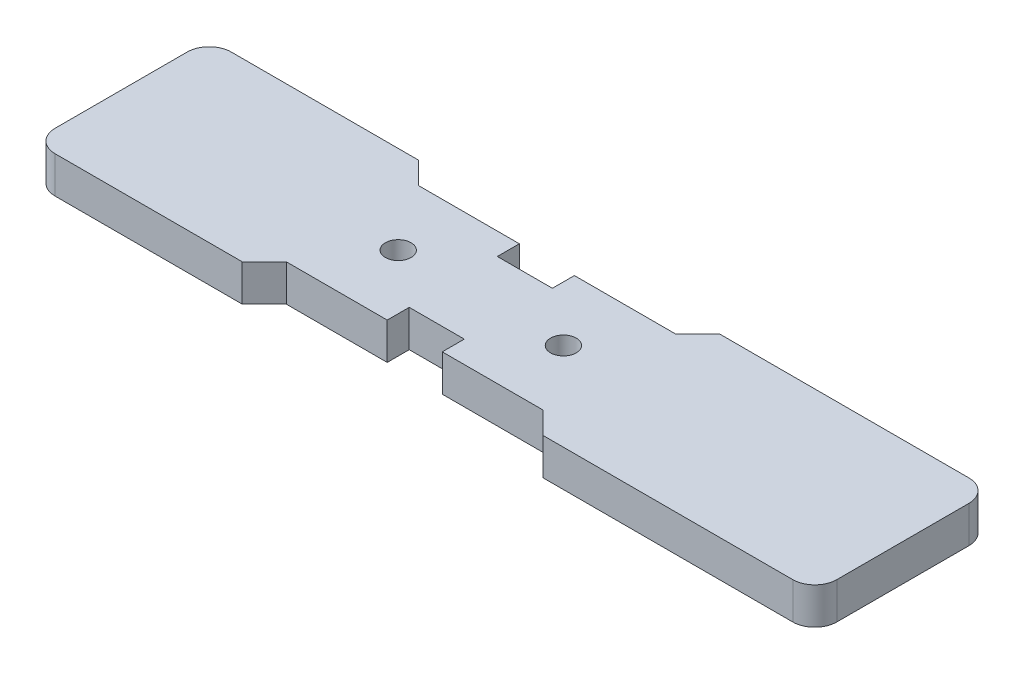
ISO-10303-21;
HEADER;
FILE_DESCRIPTION(('STEP AP214'),'2;1');
FILE_NAME('part.step','',(''),(''),'','','');
FILE_SCHEMA(('AUTOMOTIVE_DESIGN { 1 0 10303 214 1 1 1 1 }'));
ENDSEC;
DATA;
#1=APPLICATION_CONTEXT('core data for automotive mechanical design processes');
#2=APPLICATION_PROTOCOL_DEFINITION('international standard','automotive_design',2000,#1);
#3=PRODUCT_CONTEXT('',#1,'mechanical');
#4=PRODUCT('Part','Part','',(#3));
#5=PRODUCT_RELATED_PRODUCT_CATEGORY('part','',(#4));
#6=PRODUCT_DEFINITION_FORMATION('','',#4);
#7=PRODUCT_DEFINITION_CONTEXT('part definition',#1,'design');
#8=PRODUCT_DEFINITION('design','',#6,#7);
#9=PRODUCT_DEFINITION_SHAPE('','',#8);
#10=(LENGTH_UNIT() NAMED_UNIT(*) SI_UNIT(.MILLI.,.METRE.));
#11=(NAMED_UNIT(*) PLANE_ANGLE_UNIT() SI_UNIT($,.RADIAN.));
#12=(NAMED_UNIT(*) SI_UNIT($,.STERADIAN.) SOLID_ANGLE_UNIT());
#13=UNCERTAINTY_MEASURE_WITH_UNIT(LENGTH_MEASURE(1.E-05),#10,'distance_accuracy_value','');
#14=(GEOMETRIC_REPRESENTATION_CONTEXT(3) GLOBAL_UNCERTAINTY_ASSIGNED_CONTEXT((#13)) GLOBAL_UNIT_ASSIGNED_CONTEXT((#10,
#11,#12)) REPRESENTATION_CONTEXT('',''));
#15=CARTESIAN_POINT('',(0.,0.,0.));
#16=DIRECTION('',(0.,0.,1.));
#17=DIRECTION('',(1.,0.,0.));
#18=AXIS2_PLACEMENT_3D('',#15,#16,#17);
#19=CARTESIAN_POINT('',(-17.5,5.,-9.00000000000001));
#20=DIRECTION('',(0.,0.,1.));
#21=DIRECTION('',(1.,0.,0.));
#22=AXIS2_PLACEMENT_3D('',#19,#20,#21);
#23=PLANE('',#22);
#24=DIRECTION('',(-1.,0.,0.));
#25=VECTOR('',#24,1.);
#26=CARTESIAN_POINT('',(-17.5,5.,-9.00000000000001));
#27=LINE('',#26,#25);
#28=CARTESIAN_POINT('',(-3.75,5.,-9.00000000000001));
#29=VERTEX_POINT('',#28);
#30=CARTESIAN_POINT('',(-17.5,5.,-9.00000000000001));
#31=VERTEX_POINT('',#30);
#32=EDGE_CURVE('E248',#29,#31,#27,.T.);
#33=ORIENTED_EDGE('',*,*,#32,.F.);
#34=DIRECTION('',(0.,-1.,0.));
#35=VECTOR('',#34,1.);
#36=CARTESIAN_POINT('',(-3.75,5.,-9.00000000000001));
#37=LINE('',#36,#35);
#38=CARTESIAN_POINT('',(-3.75,0.,-9.00000000000001));
#39=VERTEX_POINT('',#38);
#40=EDGE_CURVE('E403',#29,#39,#37,.T.);
#41=ORIENTED_EDGE('',*,*,#40,.T.);
#42=DIRECTION('',(-1.,0.,0.));
#43=VECTOR('',#42,1.);
#44=CARTESIAN_POINT('',(-17.5,0.,-9.00000000000001));
#45=LINE('',#44,#43);
#46=CARTESIAN_POINT('',(-17.5,0.,-9.00000000000001));
#47=VERTEX_POINT('',#46);
#48=EDGE_CURVE('E256',#39,#47,#45,.T.);
#49=ORIENTED_EDGE('',*,*,#48,.T.);
#50=DIRECTION('',(0.,-1.,0.));
#51=VECTOR('',#50,1.);
#52=CARTESIAN_POINT('',(-17.5,5.,-9.00000000000001));
#53=LINE('',#52,#51);
#54=EDGE_CURVE('E245',#31,#47,#53,.T.);
#55=ORIENTED_EDGE('',*,*,#54,.F.);
#56=EDGE_LOOP('',(#33,#41,#49,#55));
#57=FACE_BOUND('',#56,.T.);
#58=ADVANCED_FACE('F41',(#57),#23,.F.);
#59=CARTESIAN_POINT('',(-17.5,5.,9.00000000000001));
#60=DIRECTION('',(0.,0.,-1.));
#61=DIRECTION('',(-1.,0.,0.));
#62=AXIS2_PLACEMENT_3D('',#59,#60,#61);
#63=PLANE('',#62);
#64=DIRECTION('',(1.,0.,0.));
#65=VECTOR('',#64,1.);
#66=CARTESIAN_POINT('',(-17.5,5.,9.00000000000001));
#67=LINE('',#66,#65);
#68=CARTESIAN_POINT('',(3.75,5.,9.00000000000002));
#69=VERTEX_POINT('',#68);
#70=CARTESIAN_POINT('',(17.5,5.,9.00000000000001));
#71=VERTEX_POINT('',#70);
#72=EDGE_CURVE('E219',#69,#71,#67,.T.);
#73=ORIENTED_EDGE('',*,*,#72,.F.);
#74=DIRECTION('',(0.,-1.,0.));
#75=VECTOR('',#74,1.);
#76=CARTESIAN_POINT('',(3.75,5.,9.00000000000002));
#77=LINE('',#76,#75);
#78=CARTESIAN_POINT('',(3.75,0.,9.00000000000002));
#79=VERTEX_POINT('',#78);
#80=EDGE_CURVE('E203',#69,#79,#77,.T.);
#81=ORIENTED_EDGE('',*,*,#80,.T.);
#82=DIRECTION('',(1.,0.,0.));
#83=VECTOR('',#82,1.);
#84=CARTESIAN_POINT('',(-17.5,0.,9.00000000000001));
#85=LINE('',#84,#83);
#86=CARTESIAN_POINT('',(17.5,0.,9.00000000000001));
#87=VERTEX_POINT('',#86);
#88=EDGE_CURVE('E235',#79,#87,#85,.T.);
#89=ORIENTED_EDGE('',*,*,#88,.T.);
#90=DIRECTION('',(0.,-1.,0.));
#91=VECTOR('',#90,1.);
#92=CARTESIAN_POINT('',(17.5,5.,9.00000000000001));
#93=LINE('',#92,#91);
#94=EDGE_CURVE('E228',#71,#87,#93,.T.);
#95=ORIENTED_EDGE('',*,*,#94,.F.);
#96=EDGE_LOOP('',(#73,#81,#89,#95));
#97=FACE_BOUND('',#96,.T.);
#98=ADVANCED_FACE('F226',(#97),#63,.F.);
#99=CARTESIAN_POINT('',(57.5,5.,12.));
#100=DIRECTION('',(0.,0.,-1.));
#101=DIRECTION('',(-1.,0.,0.));
#102=AXIS2_PLACEMENT_3D('',#99,#100,#101);
#103=PLANE('',#102);
#104=DIRECTION('',(1.,0.,0.));
#105=VECTOR('',#104,1.);
#106=CARTESIAN_POINT('',(0.,5.,12.));
#107=LINE('',#106,#105);
#108=CARTESIAN_POINT('',(20.5,5.,12.));
#109=VERTEX_POINT('',#108);
#110=CARTESIAN_POINT('',(54.5,5.,12.));
#111=VERTEX_POINT('',#110);
#112=EDGE_CURVE('E263',#109,#111,#107,.T.);
#113=ORIENTED_EDGE('',*,*,#112,.F.);
#114=DIRECTION('',(0.,-1.,0.));
#115=VECTOR('',#114,1.);
#116=CARTESIAN_POINT('',(20.5,5.,12.));
#117=LINE('',#116,#115);
#118=CARTESIAN_POINT('',(20.5,0.,12.));
#119=VERTEX_POINT('',#118);
#120=EDGE_CURVE('E50',#109,#119,#117,.T.);
#121=ORIENTED_EDGE('',*,*,#120,.T.);
#122=DIRECTION('',(1.,0.,0.));
#123=VECTOR('',#122,1.);
#124=CARTESIAN_POINT('',(57.5,0.,12.));
#125=LINE('',#124,#123);
#126=CARTESIAN_POINT('',(54.5,0.,12.));
#127=VERTEX_POINT('',#126);
#128=EDGE_CURVE('E242',#119,#127,#125,.T.);
#129=ORIENTED_EDGE('',*,*,#128,.T.);
#130=DIRECTION('',(0.,-1.,0.));
#131=VECTOR('',#130,1.);
#132=CARTESIAN_POINT('',(54.5,5.,12.));
#133=LINE('',#132,#131);
#134=EDGE_CURVE('E316',#127,#111,#133,.F.);
#135=ORIENTED_EDGE('',*,*,#134,.T.);
#136=EDGE_LOOP('',(#113,#121,#129,#135));
#137=FACE_BOUND('',#136,.T.);
#138=ADVANCED_FACE('F365',(#137),#103,.F.);
#139=CARTESIAN_POINT('',(-49.,5.,-12.));
#140=DIRECTION('',(0.,0.,1.));
#141=DIRECTION('',(1.,0.,0.));
#142=AXIS2_PLACEMENT_3D('',#139,#140,#141);
#143=PLANE('',#142);
#144=DIRECTION('',(-1.,0.,0.));
#145=VECTOR('',#144,1.);
#146=CARTESIAN_POINT('',(-49.,0.,-12.));
#147=LINE('',#146,#145);
#148=CARTESIAN_POINT('',(54.5,0.,-12.));
#149=VERTEX_POINT('',#148);
#150=CARTESIAN_POINT('',(20.5,0.,-12.));
#151=VERTEX_POINT('',#150);
#152=EDGE_CURVE('E279',#149,#151,#147,.T.);
#153=ORIENTED_EDGE('',*,*,#152,.T.);
#154=DIRECTION('',(0.,1.,0.));
#155=VECTOR('',#154,1.);
#156=CARTESIAN_POINT('',(20.5,5.,-12.));
#157=LINE('',#156,#155);
#158=CARTESIAN_POINT('',(20.5,5.,-12.));
#159=VERTEX_POINT('',#158);
#160=EDGE_CURVE('E350',#151,#159,#157,.T.);
#161=ORIENTED_EDGE('',*,*,#160,.T.);
#162=DIRECTION('',(-1.,0.,0.));
#163=VECTOR('',#162,1.);
#164=CARTESIAN_POINT('',(0.,5.,-12.));
#165=LINE('',#164,#163);
#166=CARTESIAN_POINT('',(54.5,5.,-12.));
#167=VERTEX_POINT('',#166);
#168=EDGE_CURVE('E267',#167,#159,#165,.T.);
#169=ORIENTED_EDGE('',*,*,#168,.F.);
#170=DIRECTION('',(0.,-1.,0.));
#171=VECTOR('',#170,1.);
#172=CARTESIAN_POINT('',(54.5,5.,-12.));
#173=LINE('',#172,#171);
#174=EDGE_CURVE('E290',#167,#149,#173,.T.);
#175=ORIENTED_EDGE('',*,*,#174,.T.);
#176=EDGE_LOOP('',(#153,#161,#169,#175));
#177=FACE_BOUND('',#176,.T.);
#178=ADVANCED_FACE('F388',(#177),#143,.F.);
#179=CARTESIAN_POINT('',(-46.,0.,12.));
#180=VERTEX_POINT('',#179);
#181=CARTESIAN_POINT('',(-20.5,0.,12.));
#182=VERTEX_POINT('',#181);
#183=EDGE_CURVE('E273',#180,#182,#125,.T.);
#184=ORIENTED_EDGE('',*,*,#183,.T.);
#185=DIRECTION('',(0.,1.,0.));
#186=VECTOR('',#185,1.);
#187=CARTESIAN_POINT('',(-20.5,5.,12.));
#188=LINE('',#187,#186);
#189=CARTESIAN_POINT('',(-20.5,5.,12.));
#190=VERTEX_POINT('',#189);
#191=EDGE_CURVE('E11',#182,#190,#188,.T.);
#192=ORIENTED_EDGE('',*,*,#191,.T.);
#193=CARTESIAN_POINT('',(-46.,5.,12.));
#194=VERTEX_POINT('',#193);
#195=EDGE_CURVE('E260',#194,#190,#107,.T.);
#196=ORIENTED_EDGE('',*,*,#195,.F.);
#197=DIRECTION('',(0.,-1.,0.));
#198=VECTOR('',#197,1.);
#199=CARTESIAN_POINT('',(-46.,5.,12.));
#200=LINE('',#199,#198);
#201=EDGE_CURVE('E327',#194,#180,#200,.T.);
#202=ORIENTED_EDGE('',*,*,#201,.T.);
#203=EDGE_LOOP('',(#184,#192,#196,#202));
#204=FACE_BOUND('',#203,.T.);
#205=ADVANCED_FACE('F455',(#204),#103,.F.);
#206=CARTESIAN_POINT('',(57.5,5.,-12.));
#207=DIRECTION('',(-1.,0.,0.));
#208=DIRECTION('',(0.,0.,1.));
#209=AXIS2_PLACEMENT_3D('',#206,#207,#208);
#210=PLANE('',#209);
#211=DIRECTION('',(0.,0.,-1.));
#212=VECTOR('',#211,1.);
#213=CARTESIAN_POINT('',(57.5,0.,-12.));
#214=LINE('',#213,#212);
#215=CARTESIAN_POINT('',(57.5,0.,9.));
#216=VERTEX_POINT('',#215);
#217=CARTESIAN_POINT('',(57.5,0.,-8.99999999999999));
#218=VERTEX_POINT('',#217);
#219=EDGE_CURVE('E275',#216,#218,#214,.T.);
#220=ORIENTED_EDGE('',*,*,#219,.T.);
#221=DIRECTION('',(0.,-1.,0.));
#222=VECTOR('',#221,1.);
#223=CARTESIAN_POINT('',(57.5,5.,-8.99999999999999));
#224=LINE('',#223,#222);
#225=CARTESIAN_POINT('',(57.5,5.,-8.99999999999999));
#226=VERTEX_POINT('',#225);
#227=EDGE_CURVE('E306',#218,#226,#224,.F.);
#228=ORIENTED_EDGE('',*,*,#227,.T.);
#229=DIRECTION('',(0.,0.,-1.));
#230=VECTOR('',#229,1.);
#231=CARTESIAN_POINT('',(57.5,5.,-12.));
#232=LINE('',#231,#230);
#233=CARTESIAN_POINT('',(57.5,5.,9.));
#234=VERTEX_POINT('',#233);
#235=EDGE_CURVE('E262',#234,#226,#232,.T.);
#236=ORIENTED_EDGE('',*,*,#235,.F.);
#237=DIRECTION('',(0.,-1.,0.));
#238=VECTOR('',#237,1.);
#239=CARTESIAN_POINT('',(57.5,5.,9.));
#240=LINE('',#239,#238);
#241=EDGE_CURVE('E303',#234,#216,#240,.T.);
#242=ORIENTED_EDGE('',*,*,#241,.T.);
#243=EDGE_LOOP('',(#220,#228,#236,#242));
#244=FACE_BOUND('',#243,.T.);
#245=ADVANCED_FACE('F380',(#244),#210,.F.);
#246=CARTESIAN_POINT('',(-20.5,5.,-12.));
#247=VERTEX_POINT('',#246);
#248=CARTESIAN_POINT('',(-46.,5.,-12.));
#249=VERTEX_POINT('',#248);
#250=EDGE_CURVE('E266',#247,#249,#165,.T.);
#251=ORIENTED_EDGE('',*,*,#250,.F.);
#252=DIRECTION('',(0.,-1.,0.));
#253=VECTOR('',#252,1.);
#254=CARTESIAN_POINT('',(-20.5,5.,-12.));
#255=LINE('',#254,#253);
#256=CARTESIAN_POINT('',(-20.5,0.,-12.));
#257=VERTEX_POINT('',#256);
#258=EDGE_CURVE('E359',#247,#257,#255,.T.);
#259=ORIENTED_EDGE('',*,*,#258,.T.);
#260=CARTESIAN_POINT('',(-46.,0.,-12.));
#261=VERTEX_POINT('',#260);
#262=EDGE_CURVE('E278',#257,#261,#147,.T.);
#263=ORIENTED_EDGE('',*,*,#262,.T.);
#264=DIRECTION('',(0.,-1.,0.));
#265=VECTOR('',#264,1.);
#266=CARTESIAN_POINT('',(-46.,5.,-12.));
#267=LINE('',#266,#265);
#268=EDGE_CURVE('E324',#261,#249,#267,.F.);
#269=ORIENTED_EDGE('',*,*,#268,.T.);
#270=EDGE_LOOP('',(#251,#259,#263,#269));
#271=FACE_BOUND('',#270,.T.);
#272=ADVANCED_FACE('F438',(#271),#143,.F.);
#273=CARTESIAN_POINT('',(-49.,5.,12.));
#274=DIRECTION('',(1.,0.,0.));
#275=DIRECTION('',(0.,0.,-1.));
#276=AXIS2_PLACEMENT_3D('',#273,#274,#275);
#277=PLANE('',#276);
#278=DIRECTION('',(0.,0.,1.));
#279=VECTOR('',#278,1.);
#280=CARTESIAN_POINT('',(-49.,5.,12.));
#281=LINE('',#280,#279);
#282=CARTESIAN_POINT('',(-49.,5.,-9.));
#283=VERTEX_POINT('',#282);
#284=CARTESIAN_POINT('',(-49.,5.,8.99999999999999));
#285=VERTEX_POINT('',#284);
#286=EDGE_CURVE('E269',#283,#285,#281,.T.);
#287=ORIENTED_EDGE('',*,*,#286,.F.);
#288=DIRECTION('',(0.,-1.,0.));
#289=VECTOR('',#288,1.);
#290=CARTESIAN_POINT('',(-49.,5.,-9.));
#291=LINE('',#290,#289);
#292=CARTESIAN_POINT('',(-49.,0.,-9.));
#293=VERTEX_POINT('',#292);
#294=EDGE_CURVE('E321',#283,#293,#291,.T.);
#295=ORIENTED_EDGE('',*,*,#294,.T.);
#296=DIRECTION('',(0.,0.,1.));
#297=VECTOR('',#296,1.);
#298=CARTESIAN_POINT('',(-49.,0.,12.));
#299=LINE('',#298,#297);
#300=CARTESIAN_POINT('',(-49.,0.,8.99999999999999));
#301=VERTEX_POINT('',#300);
#302=EDGE_CURVE('E282',#293,#301,#299,.T.);
#303=ORIENTED_EDGE('',*,*,#302,.T.);
#304=DIRECTION('',(0.,-1.,0.));
#305=VECTOR('',#304,1.);
#306=CARTESIAN_POINT('',(-49.,5.,8.99999999999999));
#307=LINE('',#306,#305);
#308=EDGE_CURVE('E319',#301,#285,#307,.F.);
#309=ORIENTED_EDGE('',*,*,#308,.T.);
#310=EDGE_LOOP('',(#287,#295,#303,#309));
#311=FACE_BOUND('',#310,.T.);
#312=ADVANCED_FACE('F448',(#311),#277,.F.);
#313=CARTESIAN_POINT('',(0.,5.,0.));
#314=DIRECTION('',(0.,-1.,0.));
#315=DIRECTION('',(0.,0.,-1.));
#316=AXIS2_PLACEMENT_3D('',#313,#314,#315);
#317=PLANE('',#316);
#318=CARTESIAN_POINT('',(-11.25,5.,0.));
#319=DIRECTION('',(0.,-1.,0.));
#320=DIRECTION('',(0.,0.,-1.));
#321=AXIS2_PLACEMENT_3D('',#318,#319,#320);
#322=CIRCLE('',#321,1.75);
#323=CARTESIAN_POINT('',(-11.25,5.,-1.75));
#324=VERTEX_POINT('',#323);
#325=EDGE_CURVE('E413',#324,#324,#322,.T.);
#326=ORIENTED_EDGE('',*,*,#325,.T.);
#327=EDGE_LOOP('',(#326));
#328=FACE_BOUND('',#327,.T.);
#329=CARTESIAN_POINT('',(11.25,5.,0.));
#330=DIRECTION('',(0.,-1.,0.));
#331=DIRECTION('',(0.,0.,1.));
#332=AXIS2_PLACEMENT_3D('',#329,#330,#331);
#333=CIRCLE('',#332,1.75);
#334=CARTESIAN_POINT('',(11.25,5.,1.75));
#335=VERTEX_POINT('',#334);
#336=EDGE_CURVE('E798',#335,#335,#333,.T.);
#337=ORIENTED_EDGE('',*,*,#336,.T.);
#338=EDGE_LOOP('',(#337));
#339=FACE_BOUND('',#338,.T.);
#340=ORIENTED_EDGE('',*,*,#168,.T.);
#341=DIRECTION('',(0.70710678118655,0.,-0.707106781186545));
#342=VECTOR('',#341,1.);
#343=CARTESIAN_POINT('',(17.5,5.,-9.00000000000003));
#344=LINE('',#343,#342);
#345=CARTESIAN_POINT('',(17.5,5.,-9.00000000000001));
#346=VERTEX_POINT('',#345);
#347=EDGE_CURVE('E357',#159,#346,#344,.F.);
#348=ORIENTED_EDGE('',*,*,#347,.T.);
#349=CARTESIAN_POINT('',(3.75,5.,-9.00000000000001));
#350=VERTEX_POINT('',#349);
#351=EDGE_CURVE('E257',#346,#350,#27,.T.);
#352=ORIENTED_EDGE('',*,*,#351,.T.);
#353=DIRECTION('',(0.,0.,1.));
#354=VECTOR('',#353,1.);
#355=CARTESIAN_POINT('',(3.75,5.,-6.00000000000002));
#356=LINE('',#355,#354);
#357=CARTESIAN_POINT('',(3.75,5.,-6.00000000000002));
#358=VERTEX_POINT('',#357);
#359=EDGE_CURVE('E422',#350,#358,#356,.T.);
#360=ORIENTED_EDGE('',*,*,#359,.T.);
#361=DIRECTION('',(-1.,0.,0.));
#362=VECTOR('',#361,1.);
#363=CARTESIAN_POINT('',(-3.75,5.,-6.00000000000002));
#364=LINE('',#363,#362);
#365=CARTESIAN_POINT('',(-3.75,5.,-6.00000000000002));
#366=VERTEX_POINT('',#365);
#367=EDGE_CURVE('E407',#358,#366,#364,.T.);
#368=ORIENTED_EDGE('',*,*,#367,.T.);
#369=DIRECTION('',(0.,0.,-1.));
#370=VECTOR('',#369,1.);
#371=CARTESIAN_POINT('',(-3.75,5.,-9.00000000000001));
#372=LINE('',#371,#370);
#373=EDGE_CURVE('E238',#366,#29,#372,.T.);
#374=ORIENTED_EDGE('',*,*,#373,.T.);
#375=ORIENTED_EDGE('',*,*,#32,.T.);
#376=DIRECTION('',(0.707106781186546,0.,0.707106781186549));
#377=VECTOR('',#376,1.);
#378=CARTESIAN_POINT('',(-20.5,5.,-12.));
#379=LINE('',#378,#377);
#380=EDGE_CURVE('E355',#31,#247,#379,.F.);
#381=ORIENTED_EDGE('',*,*,#380,.T.);
#382=ORIENTED_EDGE('',*,*,#250,.T.);
#383=CARTESIAN_POINT('',(-46.,5.,-9.));
#384=DIRECTION('',(0.,-1.,0.));
#385=DIRECTION('',(0.,0.,-1.));
#386=AXIS2_PLACEMENT_3D('',#383,#384,#385);
#387=CIRCLE('',#386,3.);
#388=EDGE_CURVE('E310',#249,#283,#387,.F.);
#389=ORIENTED_EDGE('',*,*,#388,.T.);
#390=ORIENTED_EDGE('',*,*,#286,.T.);
#391=CARTESIAN_POINT('',(-46.,5.,8.99999999999999));
#392=DIRECTION('',(0.,-1.,0.));
#393=DIRECTION('',(0.,0.,-1.));
#394=AXIS2_PLACEMENT_3D('',#391,#392,#393);
#395=CIRCLE('',#394,3.);
#396=EDGE_CURVE('E308',#285,#194,#395,.F.);
#397=ORIENTED_EDGE('',*,*,#396,.T.);
#398=ORIENTED_EDGE('',*,*,#195,.T.);
#399=DIRECTION('',(-0.707106781186549,0.,0.707106781186547));
#400=VECTOR('',#399,1.);
#401=CARTESIAN_POINT('',(-17.5,5.,9.00000000000002));
#402=LINE('',#401,#400);
#403=CARTESIAN_POINT('',(-17.5,5.,9.00000000000001));
#404=VERTEX_POINT('',#403);
#405=EDGE_CURVE('E352',#190,#404,#402,.F.);
#406=ORIENTED_EDGE('',*,*,#405,.T.);
#407=CARTESIAN_POINT('',(-3.75,5.,9.00000000000001));
#408=VERTEX_POINT('',#407);
#409=EDGE_CURVE('E229',#404,#408,#67,.T.);
#410=ORIENTED_EDGE('',*,*,#409,.T.);
#411=DIRECTION('',(0.,0.,-1.));
#412=VECTOR('',#411,1.);
#413=CARTESIAN_POINT('',(-3.75,5.,9.00000000000001));
#414=LINE('',#413,#412);
#415=CARTESIAN_POINT('',(-3.75,5.,6.00000000000002));
#416=VERTEX_POINT('',#415);
#417=EDGE_CURVE('E223',#408,#416,#414,.T.);
#418=ORIENTED_EDGE('',*,*,#417,.T.);
#419=DIRECTION('',(1.,0.,0.));
#420=VECTOR('',#419,1.);
#421=CARTESIAN_POINT('',(-3.75,5.,6.00000000000002));
#422=LINE('',#421,#420);
#423=CARTESIAN_POINT('',(3.75,5.,6.00000000000002));
#424=VERTEX_POINT('',#423);
#425=EDGE_CURVE('E215',#416,#424,#422,.T.);
#426=ORIENTED_EDGE('',*,*,#425,.T.);
#427=DIRECTION('',(0.,0.,1.));
#428=VECTOR('',#427,1.);
#429=CARTESIAN_POINT('',(3.75,5.,6.00000000000002));
#430=LINE('',#429,#428);
#431=EDGE_CURVE('E206',#424,#69,#430,.T.);
#432=ORIENTED_EDGE('',*,*,#431,.T.);
#433=ORIENTED_EDGE('',*,*,#72,.T.);
#434=DIRECTION('',(-0.707106781186546,0.,-0.707106781186549));
#435=VECTOR('',#434,1.);
#436=CARTESIAN_POINT('',(20.5,5.,12.));
#437=LINE('',#436,#435);
#438=EDGE_CURVE('E57',#71,#109,#437,.F.);
#439=ORIENTED_EDGE('',*,*,#438,.T.);
#440=ORIENTED_EDGE('',*,*,#112,.T.);
#441=CARTESIAN_POINT('',(54.5,5.,9.));
#442=DIRECTION('',(0.,-1.,0.));
#443=DIRECTION('',(0.,0.,-1.));
#444=AXIS2_PLACEMENT_3D('',#441,#442,#443);
#445=CIRCLE('',#444,3.);
#446=EDGE_CURVE('E312',#111,#234,#445,.F.);
#447=ORIENTED_EDGE('',*,*,#446,.T.);
#448=ORIENTED_EDGE('',*,*,#235,.T.);
#449=CARTESIAN_POINT('',(54.5,5.,-8.99999999999999));
#450=DIRECTION('',(0.,-1.,0.));
#451=DIRECTION('',(0.,0.,-1.));
#452=AXIS2_PLACEMENT_3D('',#449,#450,#451);
#453=CIRCLE('',#452,3.);
#454=EDGE_CURVE('E314',#226,#167,#453,.F.);
#455=ORIENTED_EDGE('',*,*,#454,.T.);
#456=EDGE_LOOP('',(#340,#348,#352,#360,#368,#374,#375,#381,#382,#389,#390,#397,#398,#406,#410,
#418,#426,#432,#433,#439,#440,#447,#448,#455));
#457=FACE_BOUND('',#456,.T.);
#458=ADVANCED_FACE('F218',(#328,#339,#457),#317,.F.);
#459=CARTESIAN_POINT('',(0.,0.,0.));
#460=DIRECTION('',(0.,-1.,0.));
#461=DIRECTION('',(0.,0.,-1.));
#462=AXIS2_PLACEMENT_3D('',#459,#460,#461);
#463=PLANE('',#462);
#464=CARTESIAN_POINT('',(-11.25,0.,0.));
#465=DIRECTION('',(0.,-1.,0.));
#466=DIRECTION('',(0.,0.,-1.));
#467=AXIS2_PLACEMENT_3D('',#464,#465,#466);
#468=CIRCLE('',#467,1.75);
#469=CARTESIAN_POINT('',(-11.25,0.,-1.75));
#470=VERTEX_POINT('',#469);
#471=EDGE_CURVE('E803',#470,#470,#468,.T.);
#472=ORIENTED_EDGE('',*,*,#471,.F.);
#473=EDGE_LOOP('',(#472));
#474=FACE_BOUND('',#473,.T.);
#475=CARTESIAN_POINT('',(11.25,0.,0.));
#476=DIRECTION('',(0.,-1.,0.));
#477=DIRECTION('',(0.,0.,1.));
#478=AXIS2_PLACEMENT_3D('',#475,#476,#477);
#479=CIRCLE('',#478,1.75);
#480=CARTESIAN_POINT('',(11.25,0.,1.75));
#481=VERTEX_POINT('',#480);
#482=EDGE_CURVE('E801',#481,#481,#479,.T.);
#483=ORIENTED_EDGE('',*,*,#482,.F.);
#484=EDGE_LOOP('',(#483));
#485=FACE_BOUND('',#484,.T.);
#486=CARTESIAN_POINT('',(17.5,0.,-9.00000000000001));
#487=VERTEX_POINT('',#486);
#488=CARTESIAN_POINT('',(3.75,0.,-9.00000000000002));
#489=VERTEX_POINT('',#488);
#490=EDGE_CURVE('E253',#487,#489,#45,.T.);
#491=ORIENTED_EDGE('',*,*,#490,.F.);
#492=DIRECTION('',(-0.70710678118655,0.,0.707106781186545));
#493=VECTOR('',#492,1.);
#494=CARTESIAN_POINT('',(4.24999999999992,0.,4.24999999999995));
#495=LINE('',#494,#493);
#496=EDGE_CURVE('E348',#487,#151,#495,.F.);
#497=ORIENTED_EDGE('',*,*,#496,.T.);
#498=ORIENTED_EDGE('',*,*,#152,.F.);
#499=CARTESIAN_POINT('',(54.5,0.,-8.99999999999999));
#500=DIRECTION('',(0.,-1.,0.));
#501=DIRECTION('',(0.,0.,-1.));
#502=AXIS2_PLACEMENT_3D('',#499,#500,#501);
#503=CIRCLE('',#502,3.);
#504=EDGE_CURVE('E301',#149,#218,#503,.T.);
#505=ORIENTED_EDGE('',*,*,#504,.T.);
#506=ORIENTED_EDGE('',*,*,#219,.F.);
#507=CARTESIAN_POINT('',(54.5,0.,9.));
#508=DIRECTION('',(0.,-1.,0.));
#509=DIRECTION('',(0.,0.,-1.));
#510=AXIS2_PLACEMENT_3D('',#507,#508,#509);
#511=CIRCLE('',#510,3.);
#512=EDGE_CURVE('E298',#216,#127,#511,.T.);
#513=ORIENTED_EDGE('',*,*,#512,.T.);
#514=ORIENTED_EDGE('',*,*,#128,.F.);
#515=DIRECTION('',(0.707106781186546,0.,0.707106781186549));
#516=VECTOR('',#515,1.);
#517=CARTESIAN_POINT('',(4.25000000000004,0.,-4.25000000000002));
#518=LINE('',#517,#516);
#519=EDGE_CURVE('E344',#119,#87,#518,.F.);
#520=ORIENTED_EDGE('',*,*,#519,.T.);
#521=ORIENTED_EDGE('',*,*,#88,.F.);
#522=DIRECTION('',(0.,0.,1.));
#523=VECTOR('',#522,1.);
#524=CARTESIAN_POINT('',(3.75,0.,6.00000000000002));
#525=LINE('',#524,#523);
#526=CARTESIAN_POINT('',(3.75,0.,6.00000000000002));
#527=VERTEX_POINT('',#526);
#528=EDGE_CURVE('E209',#527,#79,#525,.T.);
#529=ORIENTED_EDGE('',*,*,#528,.F.);
#530=DIRECTION('',(1.,0.,0.));
#531=VECTOR('',#530,1.);
#532=CARTESIAN_POINT('',(-3.75,0.,6.00000000000002));
#533=LINE('',#532,#531);
#534=CARTESIAN_POINT('',(-3.75,0.,6.00000000000002));
#535=VERTEX_POINT('',#534);
#536=EDGE_CURVE('E224',#535,#527,#533,.T.);
#537=ORIENTED_EDGE('',*,*,#536,.F.);
#538=DIRECTION('',(0.,0.,-1.));
#539=VECTOR('',#538,1.);
#540=CARTESIAN_POINT('',(-3.75,0.,9.00000000000001));
#541=LINE('',#540,#539);
#542=CARTESIAN_POINT('',(-3.75,0.,9.00000000000001));
#543=VERTEX_POINT('',#542);
#544=EDGE_CURVE('E471',#543,#535,#541,.T.);
#545=ORIENTED_EDGE('',*,*,#544,.F.);
#546=CARTESIAN_POINT('',(-17.5,0.,9.00000000000001));
#547=VERTEX_POINT('',#546);
#548=EDGE_CURVE('E230',#547,#543,#85,.T.);
#549=ORIENTED_EDGE('',*,*,#548,.F.);
#550=DIRECTION('',(0.707106781186549,0.,-0.707106781186547));
#551=VECTOR('',#550,1.);
#552=CARTESIAN_POINT('',(-4.24999999999996,0.,-4.24999999999998));
#553=LINE('',#552,#551);
#554=EDGE_CURVE('E342',#547,#182,#553,.F.);
#555=ORIENTED_EDGE('',*,*,#554,.T.);
#556=ORIENTED_EDGE('',*,*,#183,.F.);
#557=CARTESIAN_POINT('',(-46.,0.,8.99999999999999));
#558=DIRECTION('',(0.,-1.,0.));
#559=DIRECTION('',(0.,0.,-1.));
#560=AXIS2_PLACEMENT_3D('',#557,#558,#559);
#561=CIRCLE('',#560,3.);
#562=EDGE_CURVE('E293',#180,#301,#561,.T.);
#563=ORIENTED_EDGE('',*,*,#562,.T.);
#564=ORIENTED_EDGE('',*,*,#302,.F.);
#565=CARTESIAN_POINT('',(-46.,0.,-9.));
#566=DIRECTION('',(0.,-1.,0.));
#567=DIRECTION('',(0.,0.,-1.));
#568=AXIS2_PLACEMENT_3D('',#565,#566,#567);
#569=CIRCLE('',#568,3.);
#570=EDGE_CURVE('E295',#293,#261,#569,.T.);
#571=ORIENTED_EDGE('',*,*,#570,.T.);
#572=ORIENTED_EDGE('',*,*,#262,.F.);
#573=DIRECTION('',(-0.707106781186546,0.,-0.707106781186549));
#574=VECTOR('',#573,1.);
#575=CARTESIAN_POINT('',(-4.25000000000003,0.,4.25000000000001));
#576=LINE('',#575,#574);
#577=EDGE_CURVE('E346',#257,#47,#576,.F.);
#578=ORIENTED_EDGE('',*,*,#577,.T.);
#579=ORIENTED_EDGE('',*,*,#48,.F.);
#580=DIRECTION('',(0.,0.,-1.));
#581=VECTOR('',#580,1.);
#582=CARTESIAN_POINT('',(-3.75,0.,-9.00000000000001));
#583=LINE('',#582,#581);
#584=CARTESIAN_POINT('',(-3.75,0.,-6.00000000000002));
#585=VERTEX_POINT('',#584);
#586=EDGE_CURVE('E419',#585,#39,#583,.T.);
#587=ORIENTED_EDGE('',*,*,#586,.F.);
#588=DIRECTION('',(-1.,0.,0.));
#589=VECTOR('',#588,1.);
#590=CARTESIAN_POINT('',(-3.75,0.,-6.00000000000002));
#591=LINE('',#590,#589);
#592=CARTESIAN_POINT('',(3.75,0.,-6.00000000000002));
#593=VERTEX_POINT('',#592);
#594=EDGE_CURVE('E414',#593,#585,#591,.T.);
#595=ORIENTED_EDGE('',*,*,#594,.F.);
#596=DIRECTION('',(0.,0.,1.));
#597=VECTOR('',#596,1.);
#598=CARTESIAN_POINT('',(3.75,0.,-6.00000000000002));
#599=LINE('',#598,#597);
#600=EDGE_CURVE('E417',#489,#593,#599,.T.);
#601=ORIENTED_EDGE('',*,*,#600,.F.);
#602=EDGE_LOOP('',(#491,#497,#498,#505,#506,#513,#514,#520,#521,#529,#537,#545,#549,#555,#556,
#563,#564,#571,#572,#578,#579,#587,#595,#601));
#603=FACE_BOUND('',#602,.T.);
#604=CARTESIAN_POINT('',(-37.,0.,0.));
#605=DIRECTION('',(0.,-1.,0.));
#606=DIRECTION('',(0.,0.,-1.));
#607=AXIS2_PLACEMENT_3D('',#604,#605,#606);
#608=CIRCLE('',#607,5.);
#609=CARTESIAN_POINT('',(-37.,0.,-5.));
#610=VERTEX_POINT('',#609);
#611=EDGE_CURVE('E287',#610,#610,#608,.T.);
#612=ORIENTED_EDGE('',*,*,#611,.F.);
#613=EDGE_LOOP('',(#612));
#614=FACE_BOUND('',#613,.T.);
#615=CARTESIAN_POINT('',(45.5,0.,0.));
#616=DIRECTION('',(0.,-1.,0.));
#617=DIRECTION('',(0.,0.,-1.));
#618=AXIS2_PLACEMENT_3D('',#615,#616,#617);
#619=CIRCLE('',#618,5.);
#620=CARTESIAN_POINT('',(45.5,0.,-5.));
#621=VERTEX_POINT('',#620);
#622=EDGE_CURVE('E272',#621,#621,#619,.T.);
#623=ORIENTED_EDGE('',*,*,#622,.F.);
#624=EDGE_LOOP('',(#623));
#625=FACE_BOUND('',#624,.T.);
#626=ADVANCED_FACE('F369',(#474,#485,#603,#614,#625),#463,.T.);
#627=CARTESIAN_POINT('',(45.5,-4.,0.));
#628=DIRECTION('',(0.,1.,0.));
#629=DIRECTION('',(0.,0.,1.));
#630=AXIS2_PLACEMENT_3D('',#627,#628,#629);
#631=CYLINDRICAL_SURFACE('',#630,5.);
#632=CARTESIAN_POINT('',(45.5,-3.75,0.));
#633=DIRECTION('',(0.,-1.,0.));
#634=DIRECTION('',(0.,0.,-1.));
#635=AXIS2_PLACEMENT_3D('',#632,#633,#634);
#636=CIRCLE('',#635,5.);
#637=CARTESIAN_POINT('',(45.5,-3.75,-5.));
#638=VERTEX_POINT('',#637);
#639=EDGE_CURVE('E330',#638,#638,#636,.F.);
#640=ORIENTED_EDGE('',*,*,#639,.T.);
#641=EDGE_LOOP('',(#640));
#642=FACE_BOUND('',#641,.T.);
#643=ORIENTED_EDGE('',*,*,#622,.T.);
#644=EDGE_LOOP('',(#643));
#645=FACE_BOUND('',#644,.T.);
#646=ADVANCED_FACE('F518',(#642,#645),#631,.T.);
#647=CARTESIAN_POINT('',(45.5,-4.,0.));
#648=DIRECTION('',(0.,-1.,0.));
#649=DIRECTION('',(0.,0.,-1.));
#650=AXIS2_PLACEMENT_3D('',#647,#648,#649);
#651=PLANE('',#650);
#652=CARTESIAN_POINT('',(45.5,-4.,0.));
#653=DIRECTION('',(0.,-1.,0.));
#654=DIRECTION('',(0.,0.,-1.));
#655=AXIS2_PLACEMENT_3D('',#652,#653,#654);
#656=CIRCLE('',#655,4.75);
#657=CARTESIAN_POINT('',(45.5,-4.,-4.75));
#658=VERTEX_POINT('',#657);
#659=EDGE_CURVE('E333',#658,#658,#656,.T.);
#660=ORIENTED_EDGE('',*,*,#659,.T.);
#661=EDGE_LOOP('',(#660));
#662=FACE_BOUND('',#661,.T.);
#663=ADVANCED_FACE('F514',(#662),#651,.T.);
#664=CARTESIAN_POINT('',(-37.,-4.,0.));
#665=DIRECTION('',(0.,1.,0.));
#666=DIRECTION('',(0.,0.,1.));
#667=AXIS2_PLACEMENT_3D('',#664,#665,#666);
#668=CYLINDRICAL_SURFACE('',#667,5.);
#669=CARTESIAN_POINT('',(-37.,-3.75,0.));
#670=DIRECTION('',(0.,1.,0.));
#671=DIRECTION('',(0.,0.,1.));
#672=AXIS2_PLACEMENT_3D('',#669,#670,#671);
#673=CIRCLE('',#672,5.);
#674=CARTESIAN_POINT('',(-37.,-3.75,5.));
#675=VERTEX_POINT('',#674);
#676=EDGE_CURVE('E336',#675,#675,#673,.T.);
#677=ORIENTED_EDGE('',*,*,#676,.T.);
#678=EDGE_LOOP('',(#677));
#679=FACE_BOUND('',#678,.T.);
#680=ORIENTED_EDGE('',*,*,#611,.T.);
#681=EDGE_LOOP('',(#680));
#682=FACE_BOUND('',#681,.T.);
#683=ADVANCED_FACE('F508',(#679,#682),#668,.T.);
#684=CARTESIAN_POINT('',(-37.,-4.,0.));
#685=DIRECTION('',(0.,1.,0.));
#686=DIRECTION('',(0.,0.,1.));
#687=AXIS2_PLACEMENT_3D('',#684,#685,#686);
#688=PLANE('',#687);
#689=CARTESIAN_POINT('',(-37.,-4.,0.));
#690=DIRECTION('',(0.,1.,0.));
#691=DIRECTION('',(0.,0.,1.));
#692=AXIS2_PLACEMENT_3D('',#689,#690,#691);
#693=CIRCLE('',#692,4.75);
#694=CARTESIAN_POINT('',(-37.,-4.,4.75));
#695=VERTEX_POINT('',#694);
#696=EDGE_CURVE('E339',#695,#695,#693,.F.);
#697=ORIENTED_EDGE('',*,*,#696,.T.);
#698=EDGE_LOOP('',(#697));
#699=FACE_BOUND('',#698,.T.);
#700=ADVANCED_FACE('F502',(#699),#688,.F.);
#701=ORIENTED_EDGE('',*,*,#490,.T.);
#702=DIRECTION('',(0.,-1.,0.));
#703=VECTOR('',#702,1.);
#704=CARTESIAN_POINT('',(3.75,5.,-9.00000000000002));
#705=LINE('',#704,#703);
#706=EDGE_CURVE('E399',#350,#489,#705,.T.);
#707=ORIENTED_EDGE('',*,*,#706,.F.);
#708=ORIENTED_EDGE('',*,*,#351,.F.);
#709=DIRECTION('',(0.,-1.,0.));
#710=VECTOR('',#709,1.);
#711=CARTESIAN_POINT('',(17.5,5.,-9.00000000000001));
#712=LINE('',#711,#710);
#713=EDGE_CURVE('E249',#346,#487,#712,.T.);
#714=ORIENTED_EDGE('',*,*,#713,.T.);
#715=EDGE_LOOP('',(#701,#707,#708,#714));
#716=FACE_BOUND('',#715,.T.);
#717=ADVANCED_FACE('F398',(#716),#23,.F.);
#718=ORIENTED_EDGE('',*,*,#548,.T.);
#719=DIRECTION('',(0.,-1.,0.));
#720=VECTOR('',#719,1.);
#721=CARTESIAN_POINT('',(-3.75,5.,9.00000000000001));
#722=LINE('',#721,#720);
#723=EDGE_CURVE('E214',#408,#543,#722,.T.);
#724=ORIENTED_EDGE('',*,*,#723,.F.);
#725=ORIENTED_EDGE('',*,*,#409,.F.);
#726=DIRECTION('',(0.,-1.,0.));
#727=VECTOR('',#726,1.);
#728=CARTESIAN_POINT('',(-17.5,5.,9.00000000000001));
#729=LINE('',#728,#727);
#730=EDGE_CURVE('E233',#404,#547,#729,.T.);
#731=ORIENTED_EDGE('',*,*,#730,.T.);
#732=EDGE_LOOP('',(#718,#724,#725,#731));
#733=FACE_BOUND('',#732,.T.);
#734=ADVANCED_FACE('F463',(#733),#63,.F.);
#735=CARTESIAN_POINT('',(3.75,5.,6.00000000000002));
#736=DIRECTION('',(1.,0.,0.));
#737=DIRECTION('',(0.,0.,-1.));
#738=AXIS2_PLACEMENT_3D('',#735,#736,#737);
#739=PLANE('',#738);
#740=ORIENTED_EDGE('',*,*,#528,.T.);
#741=ORIENTED_EDGE('',*,*,#80,.F.);
#742=ORIENTED_EDGE('',*,*,#431,.F.);
#743=DIRECTION('',(0.,-1.,0.));
#744=VECTOR('',#743,1.);
#745=CARTESIAN_POINT('',(3.75,5.,6.00000000000002));
#746=LINE('',#745,#744);
#747=EDGE_CURVE('E252',#424,#527,#746,.T.);
#748=ORIENTED_EDGE('',*,*,#747,.T.);
#749=EDGE_LOOP('',(#740,#741,#742,#748));
#750=FACE_BOUND('',#749,.T.);
#751=ADVANCED_FACE('F205',(#750),#739,.F.);
#752=CARTESIAN_POINT('',(-3.75,5.,6.00000000000002));
#753=DIRECTION('',(0.,0.,-1.));
#754=DIRECTION('',(-1.,0.,0.));
#755=AXIS2_PLACEMENT_3D('',#752,#753,#754);
#756=PLANE('',#755);
#757=ORIENTED_EDGE('',*,*,#536,.T.);
#758=ORIENTED_EDGE('',*,*,#747,.F.);
#759=ORIENTED_EDGE('',*,*,#425,.F.);
#760=DIRECTION('',(0.,-1.,0.));
#761=VECTOR('',#760,1.);
#762=CARTESIAN_POINT('',(-3.75,5.,6.00000000000002));
#763=LINE('',#762,#761);
#764=EDGE_CURVE('E477',#416,#535,#763,.T.);
#765=ORIENTED_EDGE('',*,*,#764,.T.);
#766=EDGE_LOOP('',(#757,#758,#759,#765));
#767=FACE_BOUND('',#766,.T.);
#768=ADVANCED_FACE('F482',(#767),#756,.F.);
#769=CARTESIAN_POINT('',(-3.75,5.,9.00000000000001));
#770=DIRECTION('',(-1.,0.,0.));
#771=DIRECTION('',(0.,0.,1.));
#772=AXIS2_PLACEMENT_3D('',#769,#770,#771);
#773=PLANE('',#772);
#774=ORIENTED_EDGE('',*,*,#544,.T.);
#775=ORIENTED_EDGE('',*,*,#764,.F.);
#776=ORIENTED_EDGE('',*,*,#417,.F.);
#777=ORIENTED_EDGE('',*,*,#723,.T.);
#778=EDGE_LOOP('',(#774,#775,#776,#777));
#779=FACE_BOUND('',#778,.T.);
#780=ADVANCED_FACE('F479',(#779),#773,.F.);
#781=CARTESIAN_POINT('',(-3.75,5.,-9.00000000000001));
#782=DIRECTION('',(-1.,0.,0.));
#783=DIRECTION('',(0.,0.,1.));
#784=AXIS2_PLACEMENT_3D('',#781,#782,#783);
#785=PLANE('',#784);
#786=ORIENTED_EDGE('',*,*,#586,.T.);
#787=ORIENTED_EDGE('',*,*,#40,.F.);
#788=ORIENTED_EDGE('',*,*,#373,.F.);
#789=DIRECTION('',(0.,-1.,0.));
#790=VECTOR('',#789,1.);
#791=CARTESIAN_POINT('',(-3.75,5.,-6.00000000000002));
#792=LINE('',#791,#790);
#793=EDGE_CURVE('E409',#366,#585,#792,.T.);
#794=ORIENTED_EDGE('',*,*,#793,.T.);
#795=EDGE_LOOP('',(#786,#787,#788,#794));
#796=FACE_BOUND('',#795,.T.);
#797=ADVANCED_FACE('F489',(#796),#785,.F.);
#798=CARTESIAN_POINT('',(-3.75,5.,-6.00000000000002));
#799=DIRECTION('',(0.,0.,1.));
#800=DIRECTION('',(1.,0.,0.));
#801=AXIS2_PLACEMENT_3D('',#798,#799,#800);
#802=PLANE('',#801);
#803=ORIENTED_EDGE('',*,*,#594,.T.);
#804=ORIENTED_EDGE('',*,*,#793,.F.);
#805=ORIENTED_EDGE('',*,*,#367,.F.);
#806=DIRECTION('',(0.,-1.,0.));
#807=VECTOR('',#806,1.);
#808=CARTESIAN_POINT('',(3.75,5.,-6.00000000000002));
#809=LINE('',#808,#807);
#810=EDGE_CURVE('E404',#358,#593,#809,.T.);
#811=ORIENTED_EDGE('',*,*,#810,.T.);
#812=EDGE_LOOP('',(#803,#804,#805,#811));
#813=FACE_BOUND('',#812,.T.);
#814=ADVANCED_FACE('F653',(#813),#802,.F.);
#815=CARTESIAN_POINT('',(3.75,5.,-6.00000000000002));
#816=DIRECTION('',(1.,0.,0.));
#817=DIRECTION('',(0.,0.,-1.));
#818=AXIS2_PLACEMENT_3D('',#815,#816,#817);
#819=PLANE('',#818);
#820=ORIENTED_EDGE('',*,*,#600,.T.);
#821=ORIENTED_EDGE('',*,*,#810,.F.);
#822=ORIENTED_EDGE('',*,*,#359,.F.);
#823=ORIENTED_EDGE('',*,*,#706,.T.);
#824=EDGE_LOOP('',(#820,#821,#822,#823));
#825=FACE_BOUND('',#824,.T.);
#826=ADVANCED_FACE('F644',(#825),#819,.F.);
#827=CARTESIAN_POINT('',(11.25,5.,0.));
#828=DIRECTION('',(0.,-1.,0.));
#829=DIRECTION('',(0.,0.,-1.));
#830=AXIS2_PLACEMENT_3D('',#827,#828,#829);
#831=CYLINDRICAL_SURFACE('',#830,1.75);
#832=ORIENTED_EDGE('',*,*,#336,.F.);
#833=EDGE_LOOP('',(#832));
#834=FACE_BOUND('',#833,.T.);
#835=ORIENTED_EDGE('',*,*,#482,.T.);
#836=EDGE_LOOP('',(#835));
#837=FACE_BOUND('',#836,.T.);
#838=ADVANCED_FACE('F634',(#834,#837),#831,.F.);
#839=CARTESIAN_POINT('',(-11.25,5.,0.));
#840=DIRECTION('',(0.,-1.,0.));
#841=DIRECTION('',(0.,0.,-1.));
#842=AXIS2_PLACEMENT_3D('',#839,#840,#841);
#843=CYLINDRICAL_SURFACE('',#842,1.75);
#844=ORIENTED_EDGE('',*,*,#325,.F.);
#845=EDGE_LOOP('',(#844));
#846=FACE_BOUND('',#845,.T.);
#847=ORIENTED_EDGE('',*,*,#471,.T.);
#848=EDGE_LOOP('',(#847));
#849=FACE_BOUND('',#848,.T.);
#850=ADVANCED_FACE('F540',(#846,#849),#843,.F.);
#851=CARTESIAN_POINT('',(54.5,5.,-8.99999999999999));
#852=DIRECTION('',(0.,-1.,0.));
#853=DIRECTION('',(0.,0.,-1.));
#854=AXIS2_PLACEMENT_3D('',#851,#852,#853);
#855=CYLINDRICAL_SURFACE('',#854,3.);
#856=ORIENTED_EDGE('',*,*,#454,.F.);
#857=ORIENTED_EDGE('',*,*,#227,.F.);
#858=ORIENTED_EDGE('',*,*,#504,.F.);
#859=ORIENTED_EDGE('',*,*,#174,.F.);
#860=EDGE_LOOP('',(#856,#857,#858,#859));
#861=FACE_BOUND('',#860,.T.);
#862=ADVANCED_FACE('F383',(#861),#855,.T.);
#863=CARTESIAN_POINT('',(54.5,5.,9.));
#864=DIRECTION('',(0.,-1.,0.));
#865=DIRECTION('',(0.,0.,-1.));
#866=AXIS2_PLACEMENT_3D('',#863,#864,#865);
#867=CYLINDRICAL_SURFACE('',#866,3.);
#868=ORIENTED_EDGE('',*,*,#446,.F.);
#869=ORIENTED_EDGE('',*,*,#134,.F.);
#870=ORIENTED_EDGE('',*,*,#512,.F.);
#871=ORIENTED_EDGE('',*,*,#241,.F.);
#872=EDGE_LOOP('',(#868,#869,#870,#871));
#873=FACE_BOUND('',#872,.T.);
#874=ADVANCED_FACE('F376',(#873),#867,.T.);
#875=CARTESIAN_POINT('',(-46.,5.,-9.));
#876=DIRECTION('',(0.,-1.,0.));
#877=DIRECTION('',(0.,0.,-1.));
#878=AXIS2_PLACEMENT_3D('',#875,#876,#877);
#879=CYLINDRICAL_SURFACE('',#878,3.);
#880=ORIENTED_EDGE('',*,*,#388,.F.);
#881=ORIENTED_EDGE('',*,*,#268,.F.);
#882=ORIENTED_EDGE('',*,*,#570,.F.);
#883=ORIENTED_EDGE('',*,*,#294,.F.);
#884=EDGE_LOOP('',(#880,#881,#882,#883));
#885=FACE_BOUND('',#884,.T.);
#886=ADVANCED_FACE('F444',(#885),#879,.T.);
#887=CARTESIAN_POINT('',(-46.,5.,8.99999999999999));
#888=DIRECTION('',(0.,-1.,0.));
#889=DIRECTION('',(0.,0.,-1.));
#890=AXIS2_PLACEMENT_3D('',#887,#888,#889);
#891=CYLINDRICAL_SURFACE('',#890,3.);
#892=ORIENTED_EDGE('',*,*,#396,.F.);
#893=ORIENTED_EDGE('',*,*,#308,.F.);
#894=ORIENTED_EDGE('',*,*,#562,.F.);
#895=ORIENTED_EDGE('',*,*,#201,.F.);
#896=EDGE_LOOP('',(#892,#893,#894,#895));
#897=FACE_BOUND('',#896,.T.);
#898=ADVANCED_FACE('F452',(#897),#891,.T.);
#899=CARTESIAN_POINT('',(45.5,-3.75,0.));
#900=DIRECTION('',(0.,-1.,0.));
#901=DIRECTION('',(0.,0.,-1.));
#902=AXIS2_PLACEMENT_3D('',#899,#900,#901);
#903=TOROIDAL_SURFACE('',#902,4.75,0.25);
#904=ORIENTED_EDGE('',*,*,#659,.F.);
#905=EDGE_LOOP('',(#904));
#906=FACE_BOUND('',#905,.T.);
#907=ORIENTED_EDGE('',*,*,#639,.F.);
#908=EDGE_LOOP('',(#907));
#909=FACE_BOUND('',#908,.T.);
#910=ADVANCED_FACE('F547',(#906,#909),#903,.T.);
#911=CARTESIAN_POINT('',(-37.,-3.75,0.));
#912=DIRECTION('',(0.,1.,0.));
#913=DIRECTION('',(0.,0.,1.));
#914=AXIS2_PLACEMENT_3D('',#911,#912,#913);
#915=TOROIDAL_SURFACE('',#914,4.75,0.25);
#916=ORIENTED_EDGE('',*,*,#696,.F.);
#917=EDGE_LOOP('',(#916));
#918=FACE_BOUND('',#917,.T.);
#919=ORIENTED_EDGE('',*,*,#676,.F.);
#920=EDGE_LOOP('',(#919));
#921=FACE_BOUND('',#920,.T.);
#922=ADVANCED_FACE('F549',(#918,#921),#915,.T.);
#923=CARTESIAN_POINT('',(17.5,5.,-9.00000000000003));
#924=DIRECTION('',(0.707106781186545,0.,0.70710678118655));
#925=DIRECTION('',(0.,-1.,0.));
#926=AXIS2_PLACEMENT_3D('',#923,#924,#925);
#927=PLANE('',#926);
#928=ORIENTED_EDGE('',*,*,#347,.F.);
#929=ORIENTED_EDGE('',*,*,#160,.F.);
#930=ORIENTED_EDGE('',*,*,#496,.F.);
#931=ORIENTED_EDGE('',*,*,#713,.F.);
#932=EDGE_LOOP('',(#928,#929,#930,#931));
#933=FACE_BOUND('',#932,.T.);
#934=ADVANCED_FACE('F392',(#933),#927,.F.);
#935=CARTESIAN_POINT('',(-20.5,5.,-12.));
#936=DIRECTION('',(-0.707106781186549,0.,0.707106781186546));
#937=DIRECTION('',(0.,-1.,0.));
#938=AXIS2_PLACEMENT_3D('',#935,#936,#937);
#939=PLANE('',#938);
#940=ORIENTED_EDGE('',*,*,#380,.F.);
#941=ORIENTED_EDGE('',*,*,#54,.T.);
#942=ORIENTED_EDGE('',*,*,#577,.F.);
#943=ORIENTED_EDGE('',*,*,#258,.F.);
#944=EDGE_LOOP('',(#940,#941,#942,#943));
#945=FACE_BOUND('',#944,.T.);
#946=ADVANCED_FACE('F435',(#945),#939,.F.);
#947=CARTESIAN_POINT('',(20.5,5.,12.));
#948=DIRECTION('',(0.707106781186549,0.,-0.707106781186546));
#949=DIRECTION('',(0.,-1.,0.));
#950=AXIS2_PLACEMENT_3D('',#947,#948,#949);
#951=PLANE('',#950);
#952=ORIENTED_EDGE('',*,*,#438,.F.);
#953=ORIENTED_EDGE('',*,*,#94,.T.);
#954=ORIENTED_EDGE('',*,*,#519,.F.);
#955=ORIENTED_EDGE('',*,*,#120,.F.);
#956=EDGE_LOOP('',(#952,#953,#954,#955));
#957=FACE_BOUND('',#956,.T.);
#958=ADVANCED_FACE('F563',(#957),#951,.F.);
#959=CARTESIAN_POINT('',(-17.5,5.,9.00000000000002));
#960=DIRECTION('',(-0.707106781186546,0.,-0.707106781186548));
#961=DIRECTION('',(0.,-1.,0.));
#962=AXIS2_PLACEMENT_3D('',#959,#960,#961);
#963=PLANE('',#962);
#964=ORIENTED_EDGE('',*,*,#405,.F.);
#965=ORIENTED_EDGE('',*,*,#191,.F.);
#966=ORIENTED_EDGE('',*,*,#554,.F.);
#967=ORIENTED_EDGE('',*,*,#730,.F.);
#968=EDGE_LOOP('',(#964,#965,#966,#967));
#969=FACE_BOUND('',#968,.T.);
#970=ADVANCED_FACE('F44',(#969),#963,.F.);
#971=CLOSED_SHELL('',(#58,#98,#138,#178,#205,#245,#272,#312,#458,#626,#646,#663,#683,#700,#717,
#734,#751,#768,#780,#797,#814,#826,#838,#850,#862,#874,#886,#898,#910,#922,#934,#946,#958,#970));
#972=MANIFOLD_SOLID_BREP('B2',#971);
#973=ADVANCED_BREP_SHAPE_REPRESENTATION('',(#18,#972),#14);
#974=SHAPE_DEFINITION_REPRESENTATION(#9,#973);
ENDSEC;
END-ISO-10303-21;
